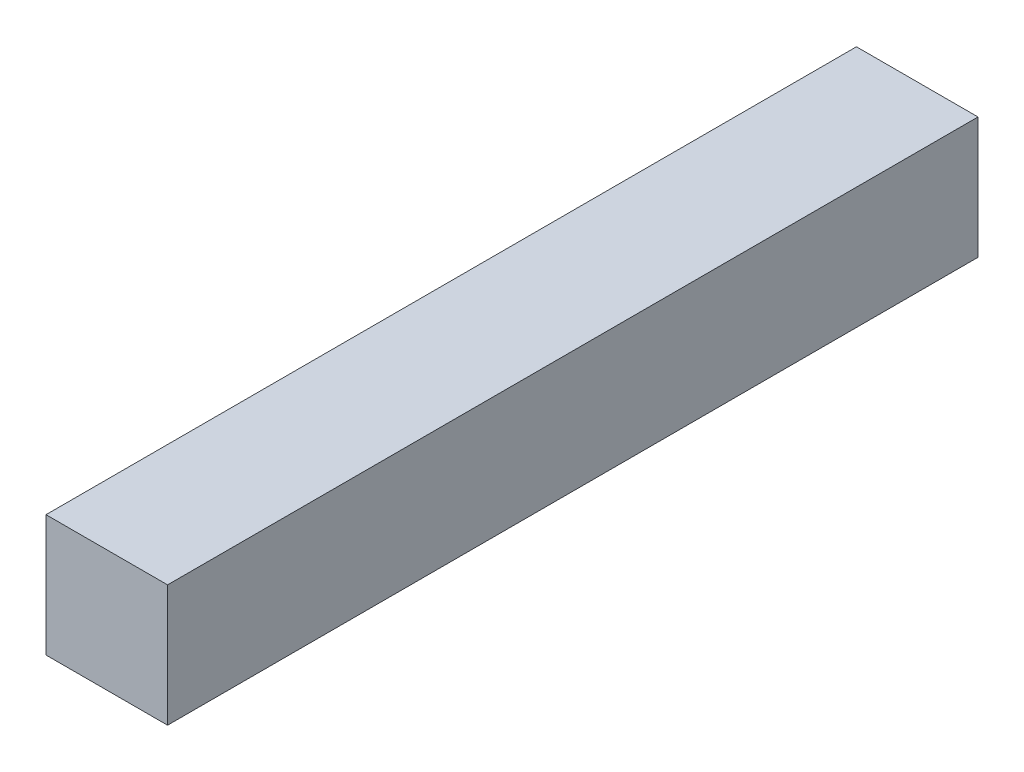
ISO-10303-21;
HEADER;
FILE_DESCRIPTION(('STEP AP214'),'2;1');
FILE_NAME('part.step','',(''),(''),'','','');
FILE_SCHEMA(('AUTOMOTIVE_DESIGN { 1 0 10303 214 1 1 1 1 }'));
ENDSEC;
DATA;
#1=APPLICATION_CONTEXT('core data for automotive mechanical design processes');
#2=APPLICATION_PROTOCOL_DEFINITION('international standard','automotive_design',2000,#1);
#3=PRODUCT_CONTEXT('',#1,'mechanical');
#4=PRODUCT('Part','Part','',(#3));
#5=PRODUCT_RELATED_PRODUCT_CATEGORY('part','',(#4));
#6=PRODUCT_DEFINITION_FORMATION('','',#4);
#7=PRODUCT_DEFINITION_CONTEXT('part definition',#1,'design');
#8=PRODUCT_DEFINITION('design','',#6,#7);
#9=PRODUCT_DEFINITION_SHAPE('','',#8);
#10=(LENGTH_UNIT() NAMED_UNIT(*) SI_UNIT(.MILLI.,.METRE.));
#11=(NAMED_UNIT(*) PLANE_ANGLE_UNIT() SI_UNIT($,.RADIAN.));
#12=(NAMED_UNIT(*) SI_UNIT($,.STERADIAN.) SOLID_ANGLE_UNIT());
#13=UNCERTAINTY_MEASURE_WITH_UNIT(LENGTH_MEASURE(1.E-05),#10,'distance_accuracy_value','');
#14=(GEOMETRIC_REPRESENTATION_CONTEXT(3) GLOBAL_UNCERTAINTY_ASSIGNED_CONTEXT((#13)) GLOBAL_UNIT_ASSIGNED_CONTEXT((#10,
#11,#12)) REPRESENTATION_CONTEXT('',''));
#15=CARTESIAN_POINT('',(0.,0.,0.));
#16=DIRECTION('',(0.,0.,1.));
#17=DIRECTION('',(1.,0.,0.));
#18=AXIS2_PLACEMENT_3D('',#15,#16,#17);
#19=CARTESIAN_POINT('',(0.,0.,50.8));
#20=DIRECTION('',(-1.,0.,0.));
#21=DIRECTION('',(0.,0.,1.));
#22=AXIS2_PLACEMENT_3D('',#19,#20,#21);
#23=PLANE('',#22);
#24=DIRECTION('',(0.,1.,0.));
#25=VECTOR('',#24,1.);
#26=CARTESIAN_POINT('',(0.,0.,0.));
#27=LINE('',#26,#25);
#28=CARTESIAN_POINT('',(0.,0.,0.));
#29=VERTEX_POINT('',#28);
#30=CARTESIAN_POINT('',(0.,7.62,0.));
#31=VERTEX_POINT('',#30);
#32=EDGE_CURVE('E96',#29,#31,#27,.T.);
#33=ORIENTED_EDGE('',*,*,#32,.T.);
#34=DIRECTION('',(0.,0.,-1.));
#35=VECTOR('',#34,1.);
#36=CARTESIAN_POINT('',(0.,7.62,50.8));
#37=LINE('',#36,#35);
#38=CARTESIAN_POINT('',(0.,7.62,50.8));
#39=VERTEX_POINT('',#38);
#40=EDGE_CURVE('E11',#39,#31,#37,.T.);
#41=ORIENTED_EDGE('',*,*,#40,.F.);
#42=DIRECTION('',(0.,1.,0.));
#43=VECTOR('',#42,1.);
#44=CARTESIAN_POINT('',(0.,0.,50.8));
#45=LINE('',#44,#43);
#46=CARTESIAN_POINT('',(0.,0.,50.8));
#47=VERTEX_POINT('',#46);
#48=EDGE_CURVE('E84',#47,#39,#45,.T.);
#49=ORIENTED_EDGE('',*,*,#48,.F.);
#50=DIRECTION('',(0.,0.,-1.));
#51=VECTOR('',#50,1.);
#52=CARTESIAN_POINT('',(0.,0.,50.8));
#53=LINE('',#52,#51);
#54=EDGE_CURVE('E92',#47,#29,#53,.T.);
#55=ORIENTED_EDGE('',*,*,#54,.T.);
#56=EDGE_LOOP('',(#33,#41,#49,#55));
#57=FACE_BOUND('',#56,.T.);
#58=ADVANCED_FACE('F33',(#57),#23,.F.);
#59=CARTESIAN_POINT('',(0.,7.62,50.8));
#60=DIRECTION('',(0.,-1.,0.));
#61=DIRECTION('',(0.,0.,-1.));
#62=AXIS2_PLACEMENT_3D('',#59,#60,#61);
#63=PLANE('',#62);
#64=DIRECTION('',(-1.,0.,0.));
#65=VECTOR('',#64,1.);
#66=CARTESIAN_POINT('',(0.,7.62,0.));
#67=LINE('',#66,#65);
#68=CARTESIAN_POINT('',(-7.62,7.62,0.));
#69=VERTEX_POINT('',#68);
#70=EDGE_CURVE('E88',#31,#69,#67,.T.);
#71=ORIENTED_EDGE('',*,*,#70,.T.);
#72=DIRECTION('',(0.,0.,-1.));
#73=VECTOR('',#72,1.);
#74=CARTESIAN_POINT('',(-7.62,7.62,50.8));
#75=LINE('',#74,#73);
#76=CARTESIAN_POINT('',(-7.62,7.62,50.8));
#77=VERTEX_POINT('',#76);
#78=EDGE_CURVE('E41',#77,#69,#75,.T.);
#79=ORIENTED_EDGE('',*,*,#78,.F.);
#80=DIRECTION('',(-1.,0.,0.));
#81=VECTOR('',#80,1.);
#82=CARTESIAN_POINT('',(0.,7.62,50.8));
#83=LINE('',#82,#81);
#84=EDGE_CURVE('E79',#39,#77,#83,.T.);
#85=ORIENTED_EDGE('',*,*,#84,.F.);
#86=ORIENTED_EDGE('',*,*,#40,.T.);
#87=EDGE_LOOP('',(#71,#79,#85,#86));
#88=FACE_BOUND('',#87,.T.);
#89=ADVANCED_FACE('F87',(#88),#63,.F.);
#90=CARTESIAN_POINT('',(-7.62,0.,50.8));
#91=DIRECTION('',(1.,0.,0.));
#92=DIRECTION('',(0.,1.,0.));
#93=AXIS2_PLACEMENT_3D('',#90,#91,#92);
#94=PLANE('',#93);
#95=DIRECTION('',(0.,-1.,0.));
#96=VECTOR('',#95,1.);
#97=CARTESIAN_POINT('',(-7.62,0.,0.));
#98=LINE('',#97,#96);
#99=CARTESIAN_POINT('',(-7.62,0.,0.));
#100=VERTEX_POINT('',#99);
#101=EDGE_CURVE('E66',#69,#100,#98,.T.);
#102=ORIENTED_EDGE('',*,*,#101,.T.);
#103=DIRECTION('',(0.,0.,-1.));
#104=VECTOR('',#103,1.);
#105=CARTESIAN_POINT('',(-7.62,0.,50.8));
#106=LINE('',#105,#104);
#107=CARTESIAN_POINT('',(-7.62,0.,50.8));
#108=VERTEX_POINT('',#107);
#109=EDGE_CURVE('E89',#108,#100,#106,.T.);
#110=ORIENTED_EDGE('',*,*,#109,.F.);
#111=DIRECTION('',(0.,-1.,0.));
#112=VECTOR('',#111,1.);
#113=CARTESIAN_POINT('',(-7.62,0.,50.8));
#114=LINE('',#113,#112);
#115=EDGE_CURVE('E82',#77,#108,#114,.T.);
#116=ORIENTED_EDGE('',*,*,#115,.F.);
#117=ORIENTED_EDGE('',*,*,#78,.T.);
#118=EDGE_LOOP('',(#102,#110,#116,#117));
#119=FACE_BOUND('',#118,.T.);
#120=ADVANCED_FACE('F90',(#119),#94,.F.);
#121=CARTESIAN_POINT('',(0.,0.,50.8));
#122=DIRECTION('',(0.,1.,0.));
#123=DIRECTION('',(-1.,0.,0.));
#124=AXIS2_PLACEMENT_3D('',#121,#122,#123);
#125=PLANE('',#124);
#126=DIRECTION('',(1.,0.,0.));
#127=VECTOR('',#126,1.);
#128=CARTESIAN_POINT('',(0.,0.,0.));
#129=LINE('',#128,#127);
#130=EDGE_CURVE('E72',#100,#29,#129,.T.);
#131=ORIENTED_EDGE('',*,*,#130,.T.);
#132=ORIENTED_EDGE('',*,*,#54,.F.);
#133=DIRECTION('',(1.,0.,0.));
#134=VECTOR('',#133,1.);
#135=CARTESIAN_POINT('',(0.,0.,50.8));
#136=LINE('',#135,#134);
#137=EDGE_CURVE('E49',#108,#47,#136,.T.);
#138=ORIENTED_EDGE('',*,*,#137,.F.);
#139=ORIENTED_EDGE('',*,*,#109,.T.);
#140=EDGE_LOOP('',(#131,#132,#138,#139));
#141=FACE_BOUND('',#140,.T.);
#142=ADVANCED_FACE('F103',(#141),#125,.F.);
#143=CARTESIAN_POINT('',(0.,0.,50.8));
#144=DIRECTION('',(0.,0.,1.));
#145=DIRECTION('',(1.,0.,0.));
#146=AXIS2_PLACEMENT_3D('',#143,#144,#145);
#147=PLANE('',#146);
#148=ORIENTED_EDGE('',*,*,#48,.T.);
#149=ORIENTED_EDGE('',*,*,#84,.T.);
#150=ORIENTED_EDGE('',*,*,#115,.T.);
#151=ORIENTED_EDGE('',*,*,#137,.T.);
#152=EDGE_LOOP('',(#148,#149,#150,#151));
#153=FACE_BOUND('',#152,.T.);
#154=ADVANCED_FACE('F80',(#153),#147,.T.);
#155=CARTESIAN_POINT('',(0.,0.,0.));
#156=DIRECTION('',(0.,0.,1.));
#157=DIRECTION('',(1.,0.,0.));
#158=AXIS2_PLACEMENT_3D('',#155,#156,#157);
#159=PLANE('',#158);
#160=ORIENTED_EDGE('',*,*,#32,.F.);
#161=ORIENTED_EDGE('',*,*,#130,.F.);
#162=ORIENTED_EDGE('',*,*,#101,.F.);
#163=ORIENTED_EDGE('',*,*,#70,.F.);
#164=EDGE_LOOP('',(#160,#161,#162,#163));
#165=FACE_BOUND('',#164,.T.);
#166=ADVANCED_FACE('F106',(#165),#159,.F.);
#167=CLOSED_SHELL('',(#58,#89,#120,#142,#154,#166));
#168=MANIFOLD_SOLID_BREP('B2',#167);
#169=ADVANCED_BREP_SHAPE_REPRESENTATION('',(#18,#168),#14);
#170=SHAPE_DEFINITION_REPRESENTATION(#9,#169);
ENDSEC;
END-ISO-10303-21;
